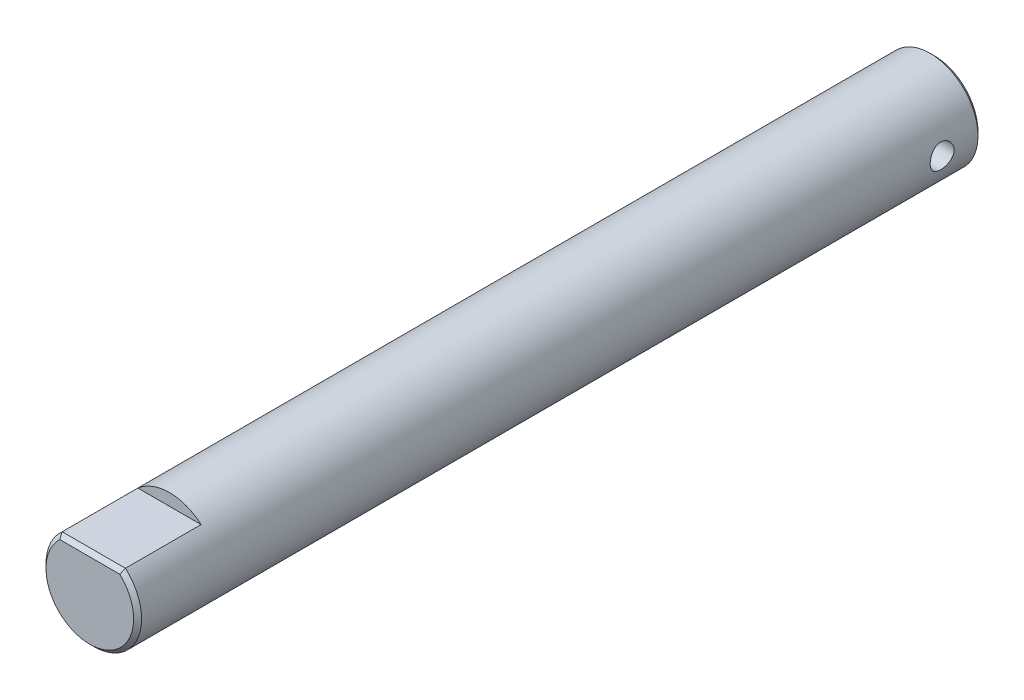
ISO-10303-21;
HEADER;
FILE_DESCRIPTION(('STEP AP214'),'2;1');
FILE_NAME('part.step','',(''),(''),'','','');
FILE_SCHEMA(('AUTOMOTIVE_DESIGN { 1 0 10303 214 1 1 1 1 }'));
ENDSEC;
DATA;
#1=APPLICATION_CONTEXT('core data for automotive mechanical design processes');
#2=APPLICATION_PROTOCOL_DEFINITION('international standard','automotive_design',2000,#1);
#3=PRODUCT_CONTEXT('',#1,'mechanical');
#4=PRODUCT('Part','Part','',(#3));
#5=PRODUCT_RELATED_PRODUCT_CATEGORY('part','',(#4));
#6=PRODUCT_DEFINITION_FORMATION('','',#4);
#7=PRODUCT_DEFINITION_CONTEXT('part definition',#1,'design');
#8=PRODUCT_DEFINITION('design','',#6,#7);
#9=PRODUCT_DEFINITION_SHAPE('','',#8);
#10=(LENGTH_UNIT() NAMED_UNIT(*) SI_UNIT(.MILLI.,.METRE.));
#11=(NAMED_UNIT(*) PLANE_ANGLE_UNIT() SI_UNIT($,.RADIAN.));
#12=(NAMED_UNIT(*) SI_UNIT($,.STERADIAN.) SOLID_ANGLE_UNIT());
#13=UNCERTAINTY_MEASURE_WITH_UNIT(LENGTH_MEASURE(1.E-05),#10,'distance_accuracy_value','');
#14=(GEOMETRIC_REPRESENTATION_CONTEXT(3) GLOBAL_UNCERTAINTY_ASSIGNED_CONTEXT((#13)) GLOBAL_UNIT_ASSIGNED_CONTEXT((#10,
#11,#12)) REPRESENTATION_CONTEXT('',''));
#15=CARTESIAN_POINT('',(0.,0.,0.));
#16=DIRECTION('',(0.,0.,1.));
#17=DIRECTION('',(1.,0.,0.));
#18=AXIS2_PLACEMENT_3D('',#15,#16,#17);
#19=CARTESIAN_POINT('',(0.,0.,-106.));
#20=DIRECTION('',(0.,0.,1.));
#21=DIRECTION('',(1.,0.,0.));
#22=AXIS2_PLACEMENT_3D('',#19,#20,#21);
#23=CYLINDRICAL_SURFACE('',#22,6.);
#24=CARTESIAN_POINT('',(0.,0.,-105.5));
#25=DIRECTION('',(0.,0.,1.));
#26=DIRECTION('',(1.,0.,0.));
#27=AXIS2_PLACEMENT_3D('',#24,#25,#26);
#28=CIRCLE('',#27,6.);
#29=CARTESIAN_POINT('',(6.,0.,-105.5));
#30=VERTEX_POINT('',#29);
#31=EDGE_CURVE('E146',#30,#30,#28,.T.);
#32=ORIENTED_EDGE('',*,*,#31,.T.);
#33=EDGE_LOOP('',(#32));
#34=FACE_BOUND('',#33,.T.);
#35=DIRECTION('',(0.,0.,1.));
#36=VECTOR('',#35,1.);
#37=CARTESIAN_POINT('',(3.96862696659689,4.5,-10.));
#38=LINE('',#37,#36);
#39=CARTESIAN_POINT('',(3.96862696659689,4.5,-10.));
#40=VERTEX_POINT('',#39);
#41=CARTESIAN_POINT('',(3.96862696659689,4.5,-0.499999999999987));
#42=VERTEX_POINT('',#41);
#43=EDGE_CURVE('E97',#40,#42,#38,.T.);
#44=ORIENTED_EDGE('',*,*,#43,.T.);
#45=CARTESIAN_POINT('',(0.,0.,-0.499999999999987));
#46=DIRECTION('',(0.,0.,1.));
#47=DIRECTION('',(1.,0.,0.));
#48=AXIS2_PLACEMENT_3D('',#45,#46,#47);
#49=CIRCLE('',#48,6.);
#50=CARTESIAN_POINT('',(-3.96862696659689,4.5,-0.499999999999987));
#51=VERTEX_POINT('',#50);
#52=EDGE_CURVE('E102',#42,#51,#49,.F.);
#53=ORIENTED_EDGE('',*,*,#52,.T.);
#54=DIRECTION('',(0.,0.,1.));
#55=VECTOR('',#54,1.);
#56=CARTESIAN_POINT('',(-3.96862696659689,4.5,-10.));
#57=LINE('',#56,#55);
#58=CARTESIAN_POINT('',(-3.96862696659689,4.5,-10.));
#59=VERTEX_POINT('',#58);
#60=EDGE_CURVE('E96',#59,#51,#57,.T.);
#61=ORIENTED_EDGE('',*,*,#60,.F.);
#62=CARTESIAN_POINT('',(0.,0.,-10.));
#63=DIRECTION('',(0.,0.,1.));
#64=DIRECTION('',(1.,0.,0.));
#65=AXIS2_PLACEMENT_3D('',#62,#63,#64);
#66=CIRCLE('',#65,6.);
#67=EDGE_CURVE('E87',#40,#59,#66,.T.);
#68=ORIENTED_EDGE('',*,*,#67,.F.);
#69=EDGE_LOOP('',(#44,#53,#61,#68));
#70=FACE_BOUND('',#69,.T.);
#71=CARTESIAN_POINT('',(-6.,0.,-99.5));
#72=CARTESIAN_POINT('',(-5.99999859868012,-0.0828760886697309,-99.5000023257382));
#73=CARTESIAN_POINT('',(-5.99826578131828,-0.165778157830763,-99.5068915507738));
#74=CARTESIAN_POINT('',(-5.99152113829892,-0.329206323770532,-99.534225151307));
#75=CARTESIAN_POINT('',(-5.98650745419968,-0.40973104687074,-99.5546772095379));
#76=CARTESIAN_POINT('',(-5.9737562633204,-0.566020872182578,-99.6084392534621));
#77=CARTESIAN_POINT('',(-5.96602202842087,-0.641791563430003,-99.6417337987153));
#78=CARTESIAN_POINT('',(-5.94865343807593,-0.786672131904426,-99.7201813900448));
#79=CARTESIAN_POINT('',(-5.9390190185405,-0.85578178434876,-99.7653348361189));
#80=CARTESIAN_POINT('',(-5.91867413591801,-0.986801927300921,-99.8672007896542));
#81=CARTESIAN_POINT('',(-5.90794707148533,-1.04855569006107,-99.9241115749592));
#82=CARTESIAN_POINT('',(-5.8867362011753,-1.16174892720331,-100.047452204909));
#83=CARTESIAN_POINT('',(-5.87625242288348,-1.21318723694914,-100.113883122946));
#84=CARTESIAN_POINT('',(-5.8565477569971,-1.30502654279903,-100.255595226737));
#85=CARTESIAN_POINT('',(-5.84734794470605,-1.34525221592535,-100.33099323081));
#86=CARTESIAN_POINT('',(-5.83149494812223,-1.41239690855052,-100.487748411658));
#87=CARTESIAN_POINT('',(-5.82484135672789,-1.43931805543933,-100.569104633326));
#88=CARTESIAN_POINT('',(-5.81500476717551,-1.47855483680429,-100.733743498202));
#89=CARTESIAN_POINT('',(-5.81175491075426,-1.49115226833334,-100.81695489605));
#90=CARTESIAN_POINT('',(-5.80889362537741,-1.50226177506785,-100.984368569014));
#91=CARTESIAN_POINT('',(-5.80928160448644,-1.50077614181797,-101.068570680699));
#92=CARTESIAN_POINT('',(-5.81359205496618,-1.48398652463928,-101.233415807744));
#93=CARTESIAN_POINT('',(-5.81742863001879,-1.46901834019052,-101.314095621465));
#94=CARTESIAN_POINT('',(-5.82806709676484,-1.4262241869031,-101.471761050911));
#95=CARTESIAN_POINT('',(-5.83486919970697,-1.39839730206942,-101.548746403029));
#96=CARTESIAN_POINT('',(-5.85075113904187,-1.33038947793715,-101.697738016252));
#97=CARTESIAN_POINT('',(-5.85985327469421,-1.29008666723291,-101.76968617179));
#98=CARTESIAN_POINT('',(-5.87929710846386,-1.19835627601495,-101.905918709757));
#99=CARTESIAN_POINT('',(-5.88963902334735,-1.14692674880883,-101.970201748067));
#100=CARTESIAN_POINT('',(-5.91075880539781,-1.03266342468121,-102.091203615694));
#101=CARTESIAN_POINT('',(-5.92154069477972,-0.969546258165853,-102.147654490061));
#102=CARTESIAN_POINT('',(-5.94205965578786,-0.834611917503697,-102.249221242464));
#103=CARTESIAN_POINT('',(-5.95179669549415,-0.762794477707943,-102.294336774264));
#104=CARTESIAN_POINT('',(-5.96917732094183,-0.612115888681391,-102.372050586224));
#105=CARTESIAN_POINT('',(-5.97681360127725,-0.533231393208621,-102.404605340254));
#106=CARTESIAN_POINT('',(-5.98907916991419,-0.370876008142877,-102.45591730571));
#107=CARTESIAN_POINT('',(-5.99370903339281,-0.287405999150478,-102.474677156418));
#108=CARTESIAN_POINT('',(-5.99935499271375,-0.120539970390019,-102.497457565559));
#109=CARTESIAN_POINT('',(-6.00046053508279,-0.0371967199882027,-102.501843026075));
#110=CARTESIAN_POINT('',(-5.99918804814451,0.129032874801513,-102.496750997945));
#111=CARTESIAN_POINT('',(-5.99681033241847,0.211919259644599,-102.487274757201));
#112=CARTESIAN_POINT('',(-5.98889581127357,0.373614268776497,-102.455029091609));
#113=CARTESIAN_POINT('',(-5.98340634185811,0.452465118968761,-102.432458736523));
#114=CARTESIAN_POINT('',(-5.96988706634134,0.605257292452518,-102.374892915972));
#115=CARTESIAN_POINT('',(-5.96185700369892,0.679198119032639,-102.339896195687));
#116=CARTESIAN_POINT('',(-5.9439330792631,0.821523134429848,-102.257763871125));
#117=CARTESIAN_POINT('',(-5.93400867366932,0.889785441835829,-102.210423887603));
#118=CARTESIAN_POINT('',(-5.91344509187419,1.01752661364325,-102.105210091203));
#119=CARTESIAN_POINT('',(-5.90280579251705,1.07700395897301,-102.047334460383));
#120=CARTESIAN_POINT('',(-5.88168956960771,1.18699056807273,-101.920998039156));
#121=CARTESIAN_POINT('',(-5.87122304187281,1.23724386762203,-101.852312296998));
#122=CARTESIAN_POINT('',(-5.85192878377239,1.3255107590127,-101.707267365534));
#123=CARTESIAN_POINT('',(-5.84310098067026,1.36352489415794,-101.63090851704));
#124=CARTESIAN_POINT('',(-5.82818094734665,1.42595142060929,-101.473094277587));
#125=CARTESIAN_POINT('',(-5.82207255291906,1.45044439665406,-101.391672371656));
#126=CARTESIAN_POINT('',(-5.81326744090184,1.48534565995378,-101.225690362111));
#127=CARTESIAN_POINT('',(-5.81056997719936,1.49575702747866,-101.141130948968));
#128=CARTESIAN_POINT('',(-5.80894901203957,1.50203859033399,-100.973878976145));
#129=CARTESIAN_POINT('',(-5.80991932728264,1.49831789778011,-100.891202564875));
#130=CARTESIAN_POINT('',(-5.81527909007843,1.47737727831286,-100.727696111332));
#131=CARTESIAN_POINT('',(-5.81966846891857,1.46015762268677,-100.646866031986));
#132=CARTESIAN_POINT('',(-5.83131260682723,1.41293131944279,-100.489791540935));
#133=CARTESIAN_POINT('',(-5.8385501523631,1.38300140468037,-100.41352269476));
#134=CARTESIAN_POINT('',(-5.85507755724829,1.31126491360506,-100.267034617286));
#135=CARTESIAN_POINT('',(-5.86436770120773,1.26945669003418,-100.196816226813));
#136=CARTESIAN_POINT('',(-5.88425634263512,1.17386774863713,-100.062445370998));
#137=CARTESIAN_POINT('',(-5.89488264831757,1.11980316291225,-99.998498926576));
#138=CARTESIAN_POINT('',(-5.91608027246286,1.00178937118973,-99.8804529552046));
#139=CARTESIAN_POINT('',(-5.9266515772706,0.937837821261143,-99.826355769887));
#140=CARTESIAN_POINT('',(-5.94677655647663,0.800467586702589,-99.7285886914354));
#141=CARTESIAN_POINT('',(-5.95630833365868,0.726898422316389,-99.6851253863284));
#142=CARTESIAN_POINT('',(-5.97304924975118,0.573266059510477,-99.6112525370595));
#143=CARTESIAN_POINT('',(-5.98026005199781,0.493207563436736,-99.5808336393515));
#144=CARTESIAN_POINT('',(-5.99048059565542,0.344410253243465,-99.5384281696703));
#145=CARTESIAN_POINT('',(-5.99402585052691,0.276380170908063,-99.5240487569466));
#146=CARTESIAN_POINT('',(-5.99878605231948,0.138906071536281,-99.5048340563781));
#147=CARTESIAN_POINT('',(-6.00000117450894,0.0694621612426152,-99.4999980506947));
#148=CARTESIAN_POINT('',(-6.,0.,-99.5));
#149=B_SPLINE_CURVE_WITH_KNOTS('',3,(#71,#72,#73,#74,#75,#76,#77,#78,#79,#80,#81,#82,#83,#84,
#85,#86,#87,#88,#89,#90,#91,#92,#93,#94,#95,#96,#97,#98,#99,#100,#101,#102,#103,#104,#105,#106,
#107,#108,#109,#110,#111,#112,#113,#114,#115,#116,#117,#118,#119,#120,#121,#122,#123,#124,#125,
#126,#127,#128,#129,#130,#131,#132,#133,#134,#135,#136,#137,#138,#139,#140,#141,#142,#143,#144,
#145,#146,#147,#148),.UNSPECIFIED.,.T.,.F.,(4,2,2,2,2,2,2,2,2,2,2,2,2,2,2,2,2,2,2,2,2,2,2,2,2,2,
2,2,2,2,2,2,2,2,2,2,2,2,4),(0.,0.24837371247189,0.496888237763901,0.745104902286105,
0.993329940169327,1.2461443543714,1.49898729580061,1.75558647545806,2.01214461169368,
2.2635629509943,2.51494038112696,2.76022497007017,3.00552703466038,3.25330527873879,
3.50112690836162,3.75601500969019,4.01091089558246,4.26668229009113,4.52240473688642,
4.77158308949276,5.02073901112742,5.26620274514037,5.5116912732229,5.76153587565351,
6.01142363008018,6.26744509204475,6.52345518749507,6.77792254614035,7.03233423252408,
7.27943780398612,7.52653640956034,7.77216400559447,8.017825681369,8.26989576409909,
8.52202569770416,8.77872185499586,9.03523363821349,9.24342242942148,9.45159556043038),.UNSPECIFIED.);
#150=CARTESIAN_POINT('',(-6.,0.,-99.5));
#151=VERTEX_POINT('',#150);
#152=EDGE_CURVE('E106',#151,#151,#149,.T.);
#153=ORIENTED_EDGE('',*,*,#152,.T.);
#154=EDGE_LOOP('',(#153));
#155=FACE_BOUND('',#154,.T.);
#156=CARTESIAN_POINT('',(6.,0.,-99.5));
#157=CARTESIAN_POINT('',(5.99999859868013,0.0828760886697306,-99.5000023257382));
#158=CARTESIAN_POINT('',(5.99826578131828,0.165778157830762,-99.5068915507738));
#159=CARTESIAN_POINT('',(5.99152113829892,0.329206323770532,-99.534225151307));
#160=CARTESIAN_POINT('',(5.98650745419968,0.409731046870739,-99.5546772095379));
#161=CARTESIAN_POINT('',(5.9737562633204,0.566020872182577,-99.6084392534621));
#162=CARTESIAN_POINT('',(5.96602202842087,0.641791563430003,-99.6417337987153));
#163=CARTESIAN_POINT('',(5.94865343807593,0.786672131904426,-99.7201813900448));
#164=CARTESIAN_POINT('',(5.9390190185405,0.855781784348759,-99.7653348361189));
#165=CARTESIAN_POINT('',(5.91867413591801,0.98680192730092,-99.8672007896542));
#166=CARTESIAN_POINT('',(5.90794707148533,1.04855569006107,-99.9241115749592));
#167=CARTESIAN_POINT('',(5.88673620117529,1.1617489272033,-100.047452204909));
#168=CARTESIAN_POINT('',(5.87625242288348,1.21318723694913,-100.113883122946));
#169=CARTESIAN_POINT('',(5.8565477569971,1.30502654279903,-100.255595226737));
#170=CARTESIAN_POINT('',(5.84734794470605,1.34525221592535,-100.33099323081));
#171=CARTESIAN_POINT('',(5.83149494812223,1.41239690855052,-100.487748411658));
#172=CARTESIAN_POINT('',(5.82484135672789,1.43931805543933,-100.569104633326));
#173=CARTESIAN_POINT('',(5.81500476717551,1.47855483680429,-100.733743498202));
#174=CARTESIAN_POINT('',(5.81175491075426,1.49115226833333,-100.81695489605));
#175=CARTESIAN_POINT('',(5.80889362537741,1.50226177506785,-100.984368569014));
#176=CARTESIAN_POINT('',(5.80928160448644,1.50077614181797,-101.068570680699));
#177=CARTESIAN_POINT('',(5.81359205496618,1.48398652463928,-101.233415807744));
#178=CARTESIAN_POINT('',(5.81742863001879,1.46901834019052,-101.314095621465));
#179=CARTESIAN_POINT('',(5.82806709676484,1.42622418690311,-101.471761050911));
#180=CARTESIAN_POINT('',(5.83486919970697,1.39839730206942,-101.548746403029));
#181=CARTESIAN_POINT('',(5.85075113904187,1.33038947793715,-101.697738016252));
#182=CARTESIAN_POINT('',(5.85985327469421,1.29008666723291,-101.76968617179));
#183=CARTESIAN_POINT('',(5.87929710846386,1.19835627601495,-101.905918709757));
#184=CARTESIAN_POINT('',(5.88963902334735,1.14692674880883,-101.970201748067));
#185=CARTESIAN_POINT('',(5.91075880539781,1.03266342468121,-102.091203615694));
#186=CARTESIAN_POINT('',(5.92154069477972,0.969546258165854,-102.147654490061));
#187=CARTESIAN_POINT('',(5.94205965578786,0.834611917503697,-102.249221242464));
#188=CARTESIAN_POINT('',(5.95179669549415,0.762794477707943,-102.294336774264));
#189=CARTESIAN_POINT('',(5.96917732094183,0.612115888681392,-102.372050586224));
#190=CARTESIAN_POINT('',(5.97681360127725,0.533231393208621,-102.404605340254));
#191=CARTESIAN_POINT('',(5.98907916991419,0.370876008142878,-102.45591730571));
#192=CARTESIAN_POINT('',(5.99370903339281,0.287405999150479,-102.474677156418));
#193=CARTESIAN_POINT('',(5.99935499271375,0.12053997039002,-102.497457565559));
#194=CARTESIAN_POINT('',(6.00046053508279,0.0371967199882038,-102.501843026075));
#195=CARTESIAN_POINT('',(5.99918804814451,-0.129032874801512,-102.496750997945));
#196=CARTESIAN_POINT('',(5.99681033241847,-0.211919259644598,-102.487274757201));
#197=CARTESIAN_POINT('',(5.98889581127357,-0.373614268776496,-102.455029091609));
#198=CARTESIAN_POINT('',(5.98340634185811,-0.452465118968761,-102.432458736523));
#199=CARTESIAN_POINT('',(5.96988706634134,-0.605257292452517,-102.374892915972));
#200=CARTESIAN_POINT('',(5.96185700369892,-0.679198119032638,-102.339896195687));
#201=CARTESIAN_POINT('',(5.9439330792631,-0.821523134429847,-102.257763871125));
#202=CARTESIAN_POINT('',(5.93400867366932,-0.889785441835829,-102.210423887603));
#203=CARTESIAN_POINT('',(5.91344509187419,-1.01752661364325,-102.105210091203));
#204=CARTESIAN_POINT('',(5.90280579251705,-1.07700395897301,-102.047334460383));
#205=CARTESIAN_POINT('',(5.88168956960771,-1.18699056807273,-101.920998039156));
#206=CARTESIAN_POINT('',(5.87122304187281,-1.23724386762203,-101.852312296998));
#207=CARTESIAN_POINT('',(5.85192878377239,-1.3255107590127,-101.707267365534));
#208=CARTESIAN_POINT('',(5.84310098067026,-1.36352489415794,-101.63090851704));
#209=CARTESIAN_POINT('',(5.82818094734665,-1.42595142060929,-101.473094277587));
#210=CARTESIAN_POINT('',(5.82207255291906,-1.45044439665406,-101.391672371656));
#211=CARTESIAN_POINT('',(5.81326744090184,-1.48534565995377,-101.225690362111));
#212=CARTESIAN_POINT('',(5.81056997719936,-1.49575702747865,-101.141130948968));
#213=CARTESIAN_POINT('',(5.80894901203957,-1.50203859033399,-100.973878976145));
#214=CARTESIAN_POINT('',(5.80991932728264,-1.49831789778011,-100.891202564875));
#215=CARTESIAN_POINT('',(5.81527909007843,-1.47737727831286,-100.727696111332));
#216=CARTESIAN_POINT('',(5.81966846891857,-1.46015762268677,-100.646866031986));
#217=CARTESIAN_POINT('',(5.83131260682723,-1.41293131944279,-100.489791540935));
#218=CARTESIAN_POINT('',(5.8385501523631,-1.38300140468037,-100.41352269476));
#219=CARTESIAN_POINT('',(5.85507755724829,-1.31126491360506,-100.267034617286));
#220=CARTESIAN_POINT('',(5.86436770120773,-1.26945669003418,-100.196816226813));
#221=CARTESIAN_POINT('',(5.88425634263512,-1.17386774863713,-100.062445370998));
#222=CARTESIAN_POINT('',(5.89488264831757,-1.11980316291225,-99.998498926576));
#223=CARTESIAN_POINT('',(5.91608027246286,-1.00178937118973,-99.8804529552046));
#224=CARTESIAN_POINT('',(5.9266515772706,-0.937837821261144,-99.826355769887));
#225=CARTESIAN_POINT('',(5.94677655647663,-0.800467586702586,-99.7285886914354));
#226=CARTESIAN_POINT('',(5.95630833365868,-0.726898422316381,-99.6851253863284));
#227=CARTESIAN_POINT('',(5.97304924975119,-0.573266059510469,-99.6112525370595));
#228=CARTESIAN_POINT('',(5.98026005199781,-0.493207563436733,-99.5808336393515));
#229=CARTESIAN_POINT('',(5.99048059565542,-0.344410253243466,-99.5384281696703));
#230=CARTESIAN_POINT('',(5.99402585052691,-0.276380170908064,-99.5240487569466));
#231=CARTESIAN_POINT('',(5.99878605231948,-0.138906071536281,-99.5048340563781));
#232=CARTESIAN_POINT('',(6.00000117450894,-0.0694621612426152,-99.4999980506947));
#233=CARTESIAN_POINT('',(6.,0.,-99.5));
#234=B_SPLINE_CURVE_WITH_KNOTS('',3,(#156,#157,#158,#159,#160,#161,#162,#163,#164,#165,#166,
#167,#168,#169,#170,#171,#172,#173,#174,#175,#176,#177,#178,#179,#180,#181,#182,#183,#184,#185,
#186,#187,#188,#189,#190,#191,#192,#193,#194,#195,#196,#197,#198,#199,#200,#201,#202,#203,#204,
#205,#206,#207,#208,#209,#210,#211,#212,#213,#214,#215,#216,#217,#218,#219,#220,#221,#222,#223,
#224,#225,#226,#227,#228,#229,#230,#231,#232,#233),.UNSPECIFIED.,.T.,.F.,(4,2,2,2,2,2,2,2,2,2,2,
2,2,2,2,2,2,2,2,2,2,2,2,2,2,2,2,2,2,2,2,2,2,2,2,2,2,2,4),(0.,0.248373712471889,
0.496888237763901,0.745104902286105,0.993329940169326,1.2461443543714,1.49898729580061,
1.75558647545806,2.01214461169367,2.26356295099429,2.51494038112696,2.76022497007017,
3.00552703466037,3.25330527873879,3.50112690836162,3.75601500969018,4.01091089558246,
4.26668229009113,4.52240473688642,4.77158308949276,5.02073901112742,5.26620274514037,
5.5116912732229,5.76153587565351,6.01142363008018,6.26744509204475,6.52345518749506,
6.77792254614035,7.03233423252406,7.27943780398612,7.52653640956033,7.77216400559446,
8.017825681369,8.26989576409909,8.52202569770416,8.77872185499586,9.03523363821349,
9.24342242942147,9.45159556043037),.UNSPECIFIED.);
#235=CARTESIAN_POINT('',(6.,0.,-99.5));
#236=VERTEX_POINT('',#235);
#237=EDGE_CURVE('E117',#236,#236,#234,.T.);
#238=ORIENTED_EDGE('',*,*,#237,.T.);
#239=EDGE_LOOP('',(#238));
#240=FACE_BOUND('',#239,.T.);
#241=ADVANCED_FACE('F43',(#34,#70,#155,#240),#23,.T.);
#242=CARTESIAN_POINT('',(0.,0.,-106.));
#243=DIRECTION('',(0.,0.,1.));
#244=DIRECTION('',(1.,0.,0.));
#245=AXIS2_PLACEMENT_3D('',#242,#243,#244);
#246=PLANE('',#245);
#247=CARTESIAN_POINT('',(0.,0.,-106.));
#248=DIRECTION('',(0.,0.,1.));
#249=DIRECTION('',(1.,0.,0.));
#250=AXIS2_PLACEMENT_3D('',#247,#248,#249);
#251=CIRCLE('',#250,5.50000000000002);
#252=CARTESIAN_POINT('',(5.50000000000002,0.,-106.));
#253=VERTEX_POINT('',#252);
#254=EDGE_CURVE('E11',#253,#253,#251,.F.);
#255=ORIENTED_EDGE('',*,*,#254,.T.);
#256=EDGE_LOOP('',(#255));
#257=FACE_BOUND('',#256,.T.);
#258=ADVANCED_FACE('F132',(#257),#246,.F.);
#259=CARTESIAN_POINT('',(0.,0.,0.));
#260=DIRECTION('',(0.,0.,1.));
#261=DIRECTION('',(1.,0.,0.));
#262=AXIS2_PLACEMENT_3D('',#259,#260,#261);
#263=PLANE('',#262);
#264=DIRECTION('',(-1.,0.,0.));
#265=VECTOR('',#264,1.);
#266=CARTESIAN_POINT('',(-3.96862696659689,4.00000000000001,0.));
#267=LINE('',#266,#265);
#268=CARTESIAN_POINT('',(3.77491721763547,4.00000000000001,0.));
#269=VERTEX_POINT('',#268);
#270=CARTESIAN_POINT('',(-3.77491721763547,4.00000000000001,0.));
#271=VERTEX_POINT('',#270);
#272=EDGE_CURVE('E155',#269,#271,#267,.T.);
#273=ORIENTED_EDGE('',*,*,#272,.T.);
#274=CARTESIAN_POINT('',(0.,0.,0.));
#275=DIRECTION('',(0.,0.,1.));
#276=DIRECTION('',(1.,0.,0.));
#277=AXIS2_PLACEMENT_3D('',#274,#275,#276);
#278=CIRCLE('',#277,5.50000000000001);
#279=EDGE_CURVE('E149',#271,#269,#278,.T.);
#280=ORIENTED_EDGE('',*,*,#279,.T.);
#281=EDGE_LOOP('',(#273,#280));
#282=FACE_BOUND('',#281,.T.);
#283=ADVANCED_FACE('F129',(#282),#263,.T.);
#284=CARTESIAN_POINT('',(6.,0.,-101.));
#285=DIRECTION('',(-1.,0.,0.));
#286=DIRECTION('',(0.,0.,1.));
#287=AXIS2_PLACEMENT_3D('',#284,#285,#286);
#288=CYLINDRICAL_SURFACE('',#287,1.5);
#289=ORIENTED_EDGE('',*,*,#237,.F.);
#290=EDGE_LOOP('',(#289));
#291=FACE_BOUND('',#290,.T.);
#292=ORIENTED_EDGE('',*,*,#152,.F.);
#293=EDGE_LOOP('',(#292));
#294=FACE_BOUND('',#293,.T.);
#295=ADVANCED_FACE('F124',(#291,#294),#288,.F.);
#296=CARTESIAN_POINT('',(-3.96862696659689,4.5,-10.));
#297=DIRECTION('',(0.,-1.,0.));
#298=DIRECTION('',(0.,0.,-1.));
#299=AXIS2_PLACEMENT_3D('',#296,#297,#298);
#300=PLANE('',#299);
#301=ORIENTED_EDGE('',*,*,#60,.T.);
#302=DIRECTION('',(1.,0.,0.));
#303=VECTOR('',#302,1.);
#304=CARTESIAN_POINT('',(3.96862696659689,4.5,-0.499999999999987));
#305=LINE('',#304,#303);
#306=EDGE_CURVE('E59',#51,#42,#305,.T.);
#307=ORIENTED_EDGE('',*,*,#306,.T.);
#308=ORIENTED_EDGE('',*,*,#43,.F.);
#309=DIRECTION('',(1.,0.,0.));
#310=VECTOR('',#309,1.);
#311=CARTESIAN_POINT('',(-3.96862696659689,4.5,-10.));
#312=LINE('',#311,#310);
#313=EDGE_CURVE('E90',#59,#40,#312,.T.);
#314=ORIENTED_EDGE('',*,*,#313,.F.);
#315=EDGE_LOOP('',(#301,#307,#308,#314));
#316=FACE_BOUND('',#315,.T.);
#317=ADVANCED_FACE('F95',(#316),#300,.F.);
#318=CARTESIAN_POINT('',(0.,0.,-10.));
#319=DIRECTION('',(0.,0.,1.));
#320=DIRECTION('',(1.,0.,0.));
#321=AXIS2_PLACEMENT_3D('',#318,#319,#320);
#322=PLANE('',#321);
#323=ORIENTED_EDGE('',*,*,#67,.T.);
#324=ORIENTED_EDGE('',*,*,#313,.T.);
#325=EDGE_LOOP('',(#323,#324));
#326=FACE_BOUND('',#325,.T.);
#327=ADVANCED_FACE('F89',(#326),#322,.T.);
#328=CARTESIAN_POINT('',(-3.96862696659689,4.5,-0.499999999999987));
#329=DIRECTION('',(0.,0.707106781186548,0.707106781186548));
#330=DIRECTION('',(-1.,0.,0.));
#331=AXIS2_PLACEMENT_3D('',#328,#329,#330);
#332=PLANE('',#331);
#333=CARTESIAN_POINT('',(3.77491721763547,3.99999999999993,0.));
#334=CARTESIAN_POINT('',(3.80795333874106,4.08318786531839,-0.0831878653184174));
#335=CARTESIAN_POINT('',(3.8406138853381,4.16644848308021,-0.166448483080208));
#336=CARTESIAN_POINT('',(3.90518380099513,4.33311514987541,-0.333115149875384));
#337=CARTESIAN_POINT('',(3.93709317071868,4.41652119878026,-0.416521198780233));
#338=CARTESIAN_POINT('',(3.96862696659723,4.49999999999993,-0.499999999999919));
#339=B_SPLINE_CURVE_WITH_KNOTS('',3,(#333,#334,#335,#336,#337,#338),.UNSPECIFIED.,.F.,.F.,(4,2,
4),(0.,0.366581982914528,0.733163641997349),.UNSPECIFIED.);
#340=EDGE_CURVE('E159',#42,#269,#339,.F.);
#341=ORIENTED_EDGE('',*,*,#340,.F.);
#342=ORIENTED_EDGE('',*,*,#306,.F.);
#343=CARTESIAN_POINT('',(-3.96862696659689,4.5,-0.499999999999987));
#344=CARTESIAN_POINT('',(-3.93709317071848,4.41652119878029,-0.41652119878028));
#345=CARTESIAN_POINT('',(-3.90518380099505,4.33311514987542,-0.333115149875409));
#346=CARTESIAN_POINT('',(-3.84061388533819,4.1664484830802,-0.166448483080184));
#347=CARTESIAN_POINT('',(-3.80795333874121,4.08318786531838,-0.0831878653183683));
#348=CARTESIAN_POINT('',(-3.77491721763565,3.99999999999994,0.));
#349=B_SPLINE_CURVE_WITH_KNOTS('',3,(#343,#344,#345,#346,#347,#348),.UNSPECIFIED.,.F.,.F.,(4,2,
4),(0.,0.366581659082822,0.73316364199735),.UNSPECIFIED.);
#350=EDGE_CURVE('E48',#271,#51,#349,.F.);
#351=ORIENTED_EDGE('',*,*,#350,.F.);
#352=ORIENTED_EDGE('',*,*,#272,.F.);
#353=EDGE_LOOP('',(#341,#342,#351,#352));
#354=FACE_BOUND('',#353,.T.);
#355=ADVANCED_FACE('F166',(#354),#332,.T.);
#356=CARTESIAN_POINT('',(0.,0.,0.));
#357=DIRECTION('',(0.,0.,-1.));
#358=DIRECTION('',(-1.,0.,0.));
#359=AXIS2_PLACEMENT_3D('',#356,#357,#358);
#360=CONICAL_SURFACE('',#359,5.50000000000001,0.785398163397448);
#361=ORIENTED_EDGE('',*,*,#350,.T.);
#362=ORIENTED_EDGE('',*,*,#52,.F.);
#363=ORIENTED_EDGE('',*,*,#340,.T.);
#364=ORIENTED_EDGE('',*,*,#279,.F.);
#365=EDGE_LOOP('',(#361,#362,#363,#364));
#366=FACE_BOUND('',#365,.T.);
#367=ADVANCED_FACE('F169',(#366),#360,.T.);
#368=CARTESIAN_POINT('',(0.,0.,-105.5));
#369=DIRECTION('',(0.,0.,1.));
#370=DIRECTION('',(1.,0.,0.));
#371=AXIS2_PLACEMENT_3D('',#368,#369,#370);
#372=CONICAL_SURFACE('',#371,6.,0.785398163397444);
#373=ORIENTED_EDGE('',*,*,#254,.F.);
#374=EDGE_LOOP('',(#373));
#375=FACE_BOUND('',#374,.T.);
#376=ORIENTED_EDGE('',*,*,#31,.F.);
#377=EDGE_LOOP('',(#376));
#378=FACE_BOUND('',#377,.T.);
#379=ADVANCED_FACE('F46',(#375,#378),#372,.T.);
#380=CLOSED_SHELL('',(#241,#258,#283,#295,#317,#327,#355,#367,#379));
#381=MANIFOLD_SOLID_BREP('B2',#380);
#382=ADVANCED_BREP_SHAPE_REPRESENTATION('',(#18,#381),#14);
#383=SHAPE_DEFINITION_REPRESENTATION(#9,#382);
ENDSEC;
END-ISO-10303-21;
